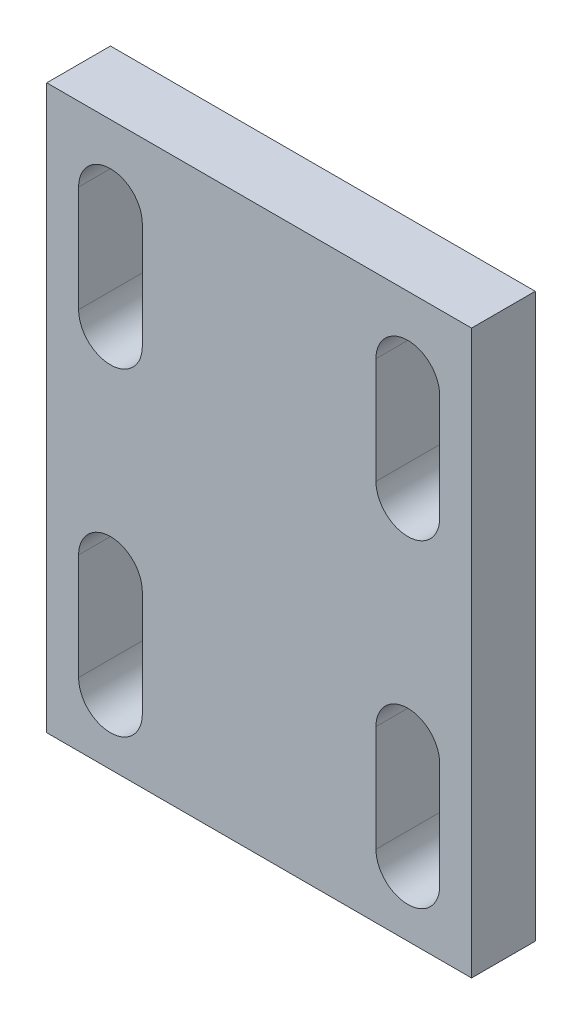
ISO-10303-21;
HEADER;
FILE_DESCRIPTION(('STEP AP214'),'2;1');
FILE_NAME('part.step','',(''),(''),'','','');
FILE_SCHEMA(('AUTOMOTIVE_DESIGN { 1 0 10303 214 1 1 1 1 }'));
ENDSEC;
DATA;
#1=APPLICATION_CONTEXT('core data for automotive mechanical design processes');
#2=APPLICATION_PROTOCOL_DEFINITION('international standard','automotive_design',2000,#1);
#3=PRODUCT_CONTEXT('',#1,'mechanical');
#4=PRODUCT('Part','Part','',(#3));
#5=PRODUCT_RELATED_PRODUCT_CATEGORY('part','',(#4));
#6=PRODUCT_DEFINITION_FORMATION('','',#4);
#7=PRODUCT_DEFINITION_CONTEXT('part definition',#1,'design');
#8=PRODUCT_DEFINITION('design','',#6,#7);
#9=PRODUCT_DEFINITION_SHAPE('','',#8);
#10=(LENGTH_UNIT() NAMED_UNIT(*) SI_UNIT(.MILLI.,.METRE.));
#11=(NAMED_UNIT(*) PLANE_ANGLE_UNIT() SI_UNIT($,.RADIAN.));
#12=(NAMED_UNIT(*) SI_UNIT($,.STERADIAN.) SOLID_ANGLE_UNIT());
#13=UNCERTAINTY_MEASURE_WITH_UNIT(LENGTH_MEASURE(1.E-05),#10,'distance_accuracy_value','');
#14=(GEOMETRIC_REPRESENTATION_CONTEXT(3) GLOBAL_UNCERTAINTY_ASSIGNED_CONTEXT((#13)) GLOBAL_UNIT_ASSIGNED_CONTEXT((#10,
#11,#12)) REPRESENTATION_CONTEXT('',''));
#15=CARTESIAN_POINT('',(0.,0.,0.));
#16=DIRECTION('',(0.,0.,1.));
#17=DIRECTION('',(1.,0.,0.));
#18=AXIS2_PLACEMENT_3D('',#15,#16,#17);
#19=CARTESIAN_POINT('',(0.,0.,3.));
#20=DIRECTION('',(0.,0.,-1.));
#21=DIRECTION('',(-1.,0.,0.));
#22=AXIS2_PLACEMENT_3D('',#19,#20,#21);
#23=PLANE('',#22);
#24=CARTESIAN_POINT('',(17.,23.,3.));
#25=DIRECTION('',(0.,0.,1.));
#26=DIRECTION('',(1.,0.,0.));
#27=AXIS2_PLACEMENT_3D('',#24,#25,#26);
#28=CIRCLE('',#27,1.5);
#29=CARTESIAN_POINT('',(18.4999999999999,23.,3.));
#30=VERTEX_POINT('',#29);
#31=CARTESIAN_POINT('',(15.4999999999999,23.,3.));
#32=VERTEX_POINT('',#31);
#33=EDGE_CURVE('E208',#30,#32,#28,.T.);
#34=ORIENTED_EDGE('',*,*,#33,.F.);
#35=DIRECTION('',(0.,1.,0.));
#36=VECTOR('',#35,1.);
#37=CARTESIAN_POINT('',(18.4999999999999,23.,3.));
#38=LINE('',#37,#36);
#39=CARTESIAN_POINT('',(18.4999999999999,18.,3.));
#40=VERTEX_POINT('',#39);
#41=EDGE_CURVE('E216',#40,#30,#38,.T.);
#42=ORIENTED_EDGE('',*,*,#41,.F.);
#43=CARTESIAN_POINT('',(17.,18.,3.));
#44=DIRECTION('',(0.,0.,1.));
#45=DIRECTION('',(1.,0.,0.));
#46=AXIS2_PLACEMENT_3D('',#43,#44,#45);
#47=CIRCLE('',#46,1.5);
#48=CARTESIAN_POINT('',(15.5,18.,3.));
#49=VERTEX_POINT('',#48);
#50=EDGE_CURVE('E213',#49,#40,#47,.T.);
#51=ORIENTED_EDGE('',*,*,#50,.F.);
#52=DIRECTION('',(0.,-1.,0.));
#53=VECTOR('',#52,1.);
#54=CARTESIAN_POINT('',(15.4999999999999,23.,3.));
#55=LINE('',#54,#53);
#56=EDGE_CURVE('E210',#32,#49,#55,.T.);
#57=ORIENTED_EDGE('',*,*,#56,.F.);
#58=EDGE_LOOP('',(#34,#42,#51,#57));
#59=FACE_BOUND('',#58,.T.);
#60=CARTESIAN_POINT('',(3.,8.,3.));
#61=DIRECTION('',(0.,0.,1.));
#62=DIRECTION('',(1.,0.,0.));
#63=AXIS2_PLACEMENT_3D('',#60,#61,#62);
#64=CIRCLE('',#63,1.5);
#65=CARTESIAN_POINT('',(4.5,8.,3.));
#66=VERTEX_POINT('',#65);
#67=CARTESIAN_POINT('',(1.5,8.,3.));
#68=VERTEX_POINT('',#67);
#69=EDGE_CURVE('E270',#66,#68,#64,.T.);
#70=ORIENTED_EDGE('',*,*,#69,.F.);
#71=DIRECTION('',(0.,1.,0.));
#72=VECTOR('',#71,1.);
#73=CARTESIAN_POINT('',(4.5,8.,3.));
#74=LINE('',#73,#72);
#75=CARTESIAN_POINT('',(4.5,3.,3.));
#76=VERTEX_POINT('',#75);
#77=EDGE_CURVE('E278',#76,#66,#74,.T.);
#78=ORIENTED_EDGE('',*,*,#77,.F.);
#79=CARTESIAN_POINT('',(3.,3.,3.));
#80=DIRECTION('',(0.,0.,1.));
#81=DIRECTION('',(1.,0.,0.));
#82=AXIS2_PLACEMENT_3D('',#79,#80,#81);
#83=CIRCLE('',#82,1.5);
#84=CARTESIAN_POINT('',(1.5,3.,3.));
#85=VERTEX_POINT('',#84);
#86=EDGE_CURVE('E275',#85,#76,#83,.T.);
#87=ORIENTED_EDGE('',*,*,#86,.F.);
#88=DIRECTION('',(0.,-1.,0.));
#89=VECTOR('',#88,1.);
#90=CARTESIAN_POINT('',(1.5,8.,3.));
#91=LINE('',#90,#89);
#92=EDGE_CURVE('E272',#68,#85,#91,.T.);
#93=ORIENTED_EDGE('',*,*,#92,.F.);
#94=EDGE_LOOP('',(#70,#78,#87,#93));
#95=FACE_BOUND('',#94,.T.);
#96=DIRECTION('',(0.,-1.,0.));
#97=VECTOR('',#96,1.);
#98=CARTESIAN_POINT('',(0.,0.,3.));
#99=LINE('',#98,#97);
#100=CARTESIAN_POINT('',(0.,26.5,3.));
#101=VERTEX_POINT('',#100);
#102=CARTESIAN_POINT('',(0.,0.,3.));
#103=VERTEX_POINT('',#102);
#104=EDGE_CURVE('E301',#101,#103,#99,.T.);
#105=ORIENTED_EDGE('',*,*,#104,.T.);
#106=DIRECTION('',(1.,0.,0.));
#107=VECTOR('',#106,1.);
#108=CARTESIAN_POINT('',(0.,0.,3.));
#109=LINE('',#108,#107);
#110=CARTESIAN_POINT('',(20.,0.,3.));
#111=VERTEX_POINT('',#110);
#112=EDGE_CURVE('E304',#103,#111,#109,.T.);
#113=ORIENTED_EDGE('',*,*,#112,.T.);
#114=DIRECTION('',(0.,1.,0.));
#115=VECTOR('',#114,1.);
#116=CARTESIAN_POINT('',(20.,0.,3.));
#117=LINE('',#116,#115);
#118=CARTESIAN_POINT('',(20.,26.5,3.));
#119=VERTEX_POINT('',#118);
#120=EDGE_CURVE('E307',#111,#119,#117,.T.);
#121=ORIENTED_EDGE('',*,*,#120,.T.);
#122=DIRECTION('',(-1.,0.,0.));
#123=VECTOR('',#122,1.);
#124=CARTESIAN_POINT('',(0.,26.5,3.));
#125=LINE('',#124,#123);
#126=EDGE_CURVE('E309',#119,#101,#125,.T.);
#127=ORIENTED_EDGE('',*,*,#126,.T.);
#128=EDGE_LOOP('',(#105,#113,#121,#127));
#129=FACE_BOUND('',#128,.T.);
#130=CARTESIAN_POINT('',(17.,8.,3.));
#131=DIRECTION('',(0.,0.,1.));
#132=DIRECTION('',(1.,0.,0.));
#133=AXIS2_PLACEMENT_3D('',#130,#131,#132);
#134=CIRCLE('',#133,1.5);
#135=CARTESIAN_POINT('',(18.5,8.,3.));
#136=VERTEX_POINT('',#135);
#137=CARTESIAN_POINT('',(15.5,8.,3.));
#138=VERTEX_POINT('',#137);
#139=EDGE_CURVE('E239',#136,#138,#134,.T.);
#140=ORIENTED_EDGE('',*,*,#139,.F.);
#141=DIRECTION('',(0.,1.,0.));
#142=VECTOR('',#141,1.);
#143=CARTESIAN_POINT('',(18.5,8.,3.));
#144=LINE('',#143,#142);
#145=CARTESIAN_POINT('',(18.5,3.,3.));
#146=VERTEX_POINT('',#145);
#147=EDGE_CURVE('E247',#146,#136,#144,.T.);
#148=ORIENTED_EDGE('',*,*,#147,.F.);
#149=CARTESIAN_POINT('',(17.,3.,3.));
#150=DIRECTION('',(0.,0.,1.));
#151=DIRECTION('',(1.,0.,0.));
#152=AXIS2_PLACEMENT_3D('',#149,#150,#151);
#153=CIRCLE('',#152,1.5);
#154=CARTESIAN_POINT('',(15.5,3.,3.));
#155=VERTEX_POINT('',#154);
#156=EDGE_CURVE('E244',#155,#146,#153,.T.);
#157=ORIENTED_EDGE('',*,*,#156,.F.);
#158=DIRECTION('',(0.,-1.,0.));
#159=VECTOR('',#158,1.);
#160=CARTESIAN_POINT('',(15.5,8.,3.));
#161=LINE('',#160,#159);
#162=EDGE_CURVE('E241',#138,#155,#161,.T.);
#163=ORIENTED_EDGE('',*,*,#162,.F.);
#164=EDGE_LOOP('',(#140,#148,#157,#163));
#165=FACE_BOUND('',#164,.T.);
#166=CARTESIAN_POINT('',(2.99999999999995,23.,3.));
#167=DIRECTION('',(0.,0.,1.));
#168=DIRECTION('',(1.,0.,0.));
#169=AXIS2_PLACEMENT_3D('',#166,#167,#168);
#170=CIRCLE('',#169,1.5);
#171=CARTESIAN_POINT('',(4.49999999999995,23.,3.));
#172=VERTEX_POINT('',#171);
#173=CARTESIAN_POINT('',(1.49999999999995,23.,3.));
#174=VERTEX_POINT('',#173);
#175=EDGE_CURVE('E172',#172,#174,#170,.T.);
#176=ORIENTED_EDGE('',*,*,#175,.F.);
#177=DIRECTION('',(0.,1.,0.));
#178=VECTOR('',#177,1.);
#179=CARTESIAN_POINT('',(4.49999999999995,23.,3.));
#180=LINE('',#179,#178);
#181=CARTESIAN_POINT('',(4.49999999999995,18.,3.));
#182=VERTEX_POINT('',#181);
#183=EDGE_CURVE('E194',#182,#172,#180,.T.);
#184=ORIENTED_EDGE('',*,*,#183,.F.);
#185=CARTESIAN_POINT('',(2.99999999999995,18.,3.));
#186=DIRECTION('',(0.,0.,1.));
#187=DIRECTION('',(1.,0.,0.));
#188=AXIS2_PLACEMENT_3D('',#185,#186,#187);
#189=CIRCLE('',#188,1.5);
#190=CARTESIAN_POINT('',(1.49999999999995,18.,3.));
#191=VERTEX_POINT('',#190);
#192=EDGE_CURVE('E192',#191,#182,#189,.T.);
#193=ORIENTED_EDGE('',*,*,#192,.F.);
#194=DIRECTION('',(0.,-1.,0.));
#195=VECTOR('',#194,1.);
#196=CARTESIAN_POINT('',(1.49999999999995,23.,3.));
#197=LINE('',#196,#195);
#198=EDGE_CURVE('E180',#174,#191,#197,.T.);
#199=ORIENTED_EDGE('',*,*,#198,.F.);
#200=EDGE_LOOP('',(#176,#184,#193,#199));
#201=FACE_BOUND('',#200,.T.);
#202=ADVANCED_FACE('F35',(#59,#95,#129,#165,#201),#23,.F.);
#203=CARTESIAN_POINT('',(0.,0.,0.));
#204=DIRECTION('',(0.,0.,-1.));
#205=DIRECTION('',(-1.,0.,0.));
#206=AXIS2_PLACEMENT_3D('',#203,#204,#205);
#207=PLANE('',#206);
#208=DIRECTION('',(0.,-1.,0.));
#209=VECTOR('',#208,1.);
#210=CARTESIAN_POINT('',(0.,0.,0.));
#211=LINE('',#210,#209);
#212=CARTESIAN_POINT('',(0.,26.5,0.));
#213=VERTEX_POINT('',#212);
#214=CARTESIAN_POINT('',(0.,0.,0.));
#215=VERTEX_POINT('',#214);
#216=EDGE_CURVE('E300',#213,#215,#211,.T.);
#217=ORIENTED_EDGE('',*,*,#216,.F.);
#218=DIRECTION('',(-1.,0.,0.));
#219=VECTOR('',#218,1.);
#220=CARTESIAN_POINT('',(0.,26.5,0.));
#221=LINE('',#220,#219);
#222=CARTESIAN_POINT('',(20.,26.5,0.));
#223=VERTEX_POINT('',#222);
#224=EDGE_CURVE('E305',#223,#213,#221,.T.);
#225=ORIENTED_EDGE('',*,*,#224,.F.);
#226=DIRECTION('',(0.,1.,0.));
#227=VECTOR('',#226,1.);
#228=CARTESIAN_POINT('',(20.,0.,0.));
#229=LINE('',#228,#227);
#230=CARTESIAN_POINT('',(20.,0.,0.));
#231=VERTEX_POINT('',#230);
#232=EDGE_CURVE('E316',#231,#223,#229,.T.);
#233=ORIENTED_EDGE('',*,*,#232,.F.);
#234=DIRECTION('',(1.,0.,0.));
#235=VECTOR('',#234,1.);
#236=CARTESIAN_POINT('',(0.,0.,0.));
#237=LINE('',#236,#235);
#238=EDGE_CURVE('E314',#215,#231,#237,.T.);
#239=ORIENTED_EDGE('',*,*,#238,.F.);
#240=EDGE_LOOP('',(#217,#225,#233,#239));
#241=FACE_BOUND('',#240,.T.);
#242=DIRECTION('',(0.,1.,0.));
#243=VECTOR('',#242,1.);
#244=CARTESIAN_POINT('',(4.5,8.,0.));
#245=LINE('',#244,#243);
#246=CARTESIAN_POINT('',(4.5,3.,0.));
#247=VERTEX_POINT('',#246);
#248=CARTESIAN_POINT('',(4.5,8.,0.));
#249=VERTEX_POINT('',#248);
#250=EDGE_CURVE('E273',#247,#249,#245,.T.);
#251=ORIENTED_EDGE('',*,*,#250,.T.);
#252=CARTESIAN_POINT('',(3.,8.,0.));
#253=DIRECTION('',(0.,0.,1.));
#254=DIRECTION('',(1.,0.,0.));
#255=AXIS2_PLACEMENT_3D('',#252,#253,#254);
#256=CIRCLE('',#255,1.5);
#257=CARTESIAN_POINT('',(1.5,8.,0.));
#258=VERTEX_POINT('',#257);
#259=EDGE_CURVE('E269',#249,#258,#256,.T.);
#260=ORIENTED_EDGE('',*,*,#259,.T.);
#261=DIRECTION('',(0.,-1.,0.));
#262=VECTOR('',#261,1.);
#263=CARTESIAN_POINT('',(1.5,8.,0.));
#264=LINE('',#263,#262);
#265=CARTESIAN_POINT('',(1.5,3.,0.));
#266=VERTEX_POINT('',#265);
#267=EDGE_CURVE('E283',#258,#266,#264,.T.);
#268=ORIENTED_EDGE('',*,*,#267,.T.);
#269=CARTESIAN_POINT('',(3.,3.,0.));
#270=DIRECTION('',(0.,0.,1.));
#271=DIRECTION('',(1.,0.,0.));
#272=AXIS2_PLACEMENT_3D('',#269,#270,#271);
#273=CIRCLE('',#272,1.5);
#274=EDGE_CURVE('E286',#266,#247,#273,.T.);
#275=ORIENTED_EDGE('',*,*,#274,.T.);
#276=EDGE_LOOP('',(#251,#260,#268,#275));
#277=FACE_BOUND('',#276,.T.);
#278=DIRECTION('',(0.,1.,0.));
#279=VECTOR('',#278,1.);
#280=CARTESIAN_POINT('',(18.5,8.,0.));
#281=LINE('',#280,#279);
#282=CARTESIAN_POINT('',(18.5,3.,0.));
#283=VERTEX_POINT('',#282);
#284=CARTESIAN_POINT('',(18.5,8.,0.));
#285=VERTEX_POINT('',#284);
#286=EDGE_CURVE('E242',#283,#285,#281,.T.);
#287=ORIENTED_EDGE('',*,*,#286,.T.);
#288=CARTESIAN_POINT('',(17.,8.,0.));
#289=DIRECTION('',(0.,0.,1.));
#290=DIRECTION('',(1.,0.,0.));
#291=AXIS2_PLACEMENT_3D('',#288,#289,#290);
#292=CIRCLE('',#291,1.5);
#293=CARTESIAN_POINT('',(15.5,8.,0.));
#294=VERTEX_POINT('',#293);
#295=EDGE_CURVE('E238',#285,#294,#292,.T.);
#296=ORIENTED_EDGE('',*,*,#295,.T.);
#297=DIRECTION('',(0.,-1.,0.));
#298=VECTOR('',#297,1.);
#299=CARTESIAN_POINT('',(15.5,8.,0.));
#300=LINE('',#299,#298);
#301=CARTESIAN_POINT('',(15.5,3.,0.));
#302=VERTEX_POINT('',#301);
#303=EDGE_CURVE('E252',#294,#302,#300,.T.);
#304=ORIENTED_EDGE('',*,*,#303,.T.);
#305=CARTESIAN_POINT('',(17.,3.,0.));
#306=DIRECTION('',(0.,0.,1.));
#307=DIRECTION('',(1.,0.,0.));
#308=AXIS2_PLACEMENT_3D('',#305,#306,#307);
#309=CIRCLE('',#308,1.5);
#310=EDGE_CURVE('E255',#302,#283,#309,.T.);
#311=ORIENTED_EDGE('',*,*,#310,.T.);
#312=EDGE_LOOP('',(#287,#296,#304,#311));
#313=FACE_BOUND('',#312,.T.);
#314=DIRECTION('',(0.,1.,0.));
#315=VECTOR('',#314,1.);
#316=CARTESIAN_POINT('',(18.4999999999999,23.,0.));
#317=LINE('',#316,#315);
#318=CARTESIAN_POINT('',(18.4999999999999,18.,0.));
#319=VERTEX_POINT('',#318);
#320=CARTESIAN_POINT('',(18.4999999999999,23.,0.));
#321=VERTEX_POINT('',#320);
#322=EDGE_CURVE('E211',#319,#321,#317,.T.);
#323=ORIENTED_EDGE('',*,*,#322,.T.);
#324=CARTESIAN_POINT('',(17.,23.,0.));
#325=DIRECTION('',(0.,0.,1.));
#326=DIRECTION('',(1.,0.,0.));
#327=AXIS2_PLACEMENT_3D('',#324,#325,#326);
#328=CIRCLE('',#327,1.5);
#329=CARTESIAN_POINT('',(15.4999999999999,23.,0.));
#330=VERTEX_POINT('',#329);
#331=EDGE_CURVE('E188',#321,#330,#328,.T.);
#332=ORIENTED_EDGE('',*,*,#331,.T.);
#333=DIRECTION('',(0.,-1.,0.));
#334=VECTOR('',#333,1.);
#335=CARTESIAN_POINT('',(15.4999999999999,23.,0.));
#336=LINE('',#335,#334);
#337=CARTESIAN_POINT('',(15.5,18.,0.));
#338=VERTEX_POINT('',#337);
#339=EDGE_CURVE('E221',#330,#338,#336,.T.);
#340=ORIENTED_EDGE('',*,*,#339,.T.);
#341=CARTESIAN_POINT('',(17.,18.,0.));
#342=DIRECTION('',(0.,0.,1.));
#343=DIRECTION('',(1.,0.,0.));
#344=AXIS2_PLACEMENT_3D('',#341,#342,#343);
#345=CIRCLE('',#344,1.5);
#346=EDGE_CURVE('E224',#338,#319,#345,.T.);
#347=ORIENTED_EDGE('',*,*,#346,.T.);
#348=EDGE_LOOP('',(#323,#332,#340,#347));
#349=FACE_BOUND('',#348,.T.);
#350=DIRECTION('',(0.,1.,0.));
#351=VECTOR('',#350,1.);
#352=CARTESIAN_POINT('',(4.49999999999995,23.,0.));
#353=LINE('',#352,#351);
#354=CARTESIAN_POINT('',(4.49999999999995,18.,0.));
#355=VERTEX_POINT('',#354);
#356=CARTESIAN_POINT('',(4.49999999999995,23.,0.));
#357=VERTEX_POINT('',#356);
#358=EDGE_CURVE('E181',#355,#357,#353,.T.);
#359=ORIENTED_EDGE('',*,*,#358,.T.);
#360=CARTESIAN_POINT('',(2.99999999999995,23.,0.));
#361=DIRECTION('',(0.,0.,1.));
#362=DIRECTION('',(1.,0.,0.));
#363=AXIS2_PLACEMENT_3D('',#360,#361,#362);
#364=CIRCLE('',#363,1.5);
#365=CARTESIAN_POINT('',(1.49999999999995,23.,0.));
#366=VERTEX_POINT('',#365);
#367=EDGE_CURVE('E58',#357,#366,#364,.T.);
#368=ORIENTED_EDGE('',*,*,#367,.T.);
#369=DIRECTION('',(0.,-1.,0.));
#370=VECTOR('',#369,1.);
#371=CARTESIAN_POINT('',(1.49999999999995,23.,0.));
#372=LINE('',#371,#370);
#373=CARTESIAN_POINT('',(1.49999999999995,18.,0.));
#374=VERTEX_POINT('',#373);
#375=EDGE_CURVE('E187',#366,#374,#372,.T.);
#376=ORIENTED_EDGE('',*,*,#375,.T.);
#377=CARTESIAN_POINT('',(2.99999999999995,18.,0.));
#378=DIRECTION('',(0.,0.,1.));
#379=DIRECTION('',(1.,0.,0.));
#380=AXIS2_PLACEMENT_3D('',#377,#378,#379);
#381=CIRCLE('',#380,1.5);
#382=EDGE_CURVE('E200',#374,#355,#381,.T.);
#383=ORIENTED_EDGE('',*,*,#382,.T.);
#384=EDGE_LOOP('',(#359,#368,#376,#383));
#385=FACE_BOUND('',#384,.T.);
#386=ADVANCED_FACE('F334',(#241,#277,#313,#349,#385),#207,.T.);
#387=CARTESIAN_POINT('',(0.,0.,3.));
#388=DIRECTION('',(1.,0.,0.));
#389=DIRECTION('',(0.,0.,-1.));
#390=AXIS2_PLACEMENT_3D('',#387,#388,#389);
#391=PLANE('',#390);
#392=ORIENTED_EDGE('',*,*,#216,.T.);
#393=DIRECTION('',(0.,0.,-1.));
#394=VECTOR('',#393,1.);
#395=CARTESIAN_POINT('',(0.,0.,3.));
#396=LINE('',#395,#394);
#397=EDGE_CURVE('E11',#103,#215,#396,.T.);
#398=ORIENTED_EDGE('',*,*,#397,.F.);
#399=ORIENTED_EDGE('',*,*,#104,.F.);
#400=DIRECTION('',(0.,0.,-1.));
#401=VECTOR('',#400,1.);
#402=CARTESIAN_POINT('',(0.,26.5,3.));
#403=LINE('',#402,#401);
#404=EDGE_CURVE('E311',#101,#213,#403,.T.);
#405=ORIENTED_EDGE('',*,*,#404,.T.);
#406=EDGE_LOOP('',(#392,#398,#399,#405));
#407=FACE_BOUND('',#406,.T.);
#408=ADVANCED_FACE('F37',(#407),#391,.F.);
#409=CARTESIAN_POINT('',(0.,0.,3.));
#410=DIRECTION('',(0.,1.,0.));
#411=DIRECTION('',(0.,0.,1.));
#412=AXIS2_PLACEMENT_3D('',#409,#410,#411);
#413=PLANE('',#412);
#414=ORIENTED_EDGE('',*,*,#238,.T.);
#415=DIRECTION('',(0.,0.,-1.));
#416=VECTOR('',#415,1.);
#417=CARTESIAN_POINT('',(20.,0.,3.));
#418=LINE('',#417,#416);
#419=EDGE_CURVE('E43',#111,#231,#418,.T.);
#420=ORIENTED_EDGE('',*,*,#419,.F.);
#421=ORIENTED_EDGE('',*,*,#112,.F.);
#422=ORIENTED_EDGE('',*,*,#397,.T.);
#423=EDGE_LOOP('',(#414,#420,#421,#422));
#424=FACE_BOUND('',#423,.T.);
#425=ADVANCED_FACE('F345',(#424),#413,.F.);
#426=CARTESIAN_POINT('',(20.,0.,3.));
#427=DIRECTION('',(-1.,0.,0.));
#428=DIRECTION('',(0.,0.,1.));
#429=AXIS2_PLACEMENT_3D('',#426,#427,#428);
#430=PLANE('',#429);
#431=ORIENTED_EDGE('',*,*,#232,.T.);
#432=DIRECTION('',(0.,0.,-1.));
#433=VECTOR('',#432,1.);
#434=CARTESIAN_POINT('',(20.,26.5,3.));
#435=LINE('',#434,#433);
#436=EDGE_CURVE('E321',#119,#223,#435,.T.);
#437=ORIENTED_EDGE('',*,*,#436,.F.);
#438=ORIENTED_EDGE('',*,*,#120,.F.);
#439=ORIENTED_EDGE('',*,*,#419,.T.);
#440=EDGE_LOOP('',(#431,#437,#438,#439));
#441=FACE_BOUND('',#440,.T.);
#442=ADVANCED_FACE('F328',(#441),#430,.F.);
#443=CARTESIAN_POINT('',(0.,26.5,3.));
#444=DIRECTION('',(0.,-1.,0.));
#445=DIRECTION('',(0.,0.,-1.));
#446=AXIS2_PLACEMENT_3D('',#443,#444,#445);
#447=PLANE('',#446);
#448=ORIENTED_EDGE('',*,*,#224,.T.);
#449=ORIENTED_EDGE('',*,*,#404,.F.);
#450=ORIENTED_EDGE('',*,*,#126,.F.);
#451=ORIENTED_EDGE('',*,*,#436,.T.);
#452=EDGE_LOOP('',(#448,#449,#450,#451));
#453=FACE_BOUND('',#452,.T.);
#454=ADVANCED_FACE('F338',(#453),#447,.F.);
#455=CARTESIAN_POINT('',(3.,8.,3.));
#456=DIRECTION('',(0.,0.,-1.));
#457=DIRECTION('',(-1.,0.,0.));
#458=AXIS2_PLACEMENT_3D('',#455,#456,#457);
#459=CYLINDRICAL_SURFACE('',#458,1.5);
#460=ORIENTED_EDGE('',*,*,#259,.F.);
#461=DIRECTION('',(0.,0.,-1.));
#462=VECTOR('',#461,1.);
#463=CARTESIAN_POINT('',(4.5,8.,3.));
#464=LINE('',#463,#462);
#465=EDGE_CURVE('E280',#66,#249,#464,.T.);
#466=ORIENTED_EDGE('',*,*,#465,.F.);
#467=ORIENTED_EDGE('',*,*,#69,.T.);
#468=DIRECTION('',(0.,0.,-1.));
#469=VECTOR('',#468,1.);
#470=CARTESIAN_POINT('',(1.5,8.,3.));
#471=LINE('',#470,#469);
#472=EDGE_CURVE('E297',#68,#258,#471,.T.);
#473=ORIENTED_EDGE('',*,*,#472,.T.);
#474=EDGE_LOOP('',(#460,#466,#467,#473));
#475=FACE_BOUND('',#474,.T.);
#476=ADVANCED_FACE('F362',(#475),#459,.F.);
#477=CARTESIAN_POINT('',(1.5,8.,3.));
#478=DIRECTION('',(1.,0.,0.));
#479=DIRECTION('',(0.,0.,-1.));
#480=AXIS2_PLACEMENT_3D('',#477,#478,#479);
#481=PLANE('',#480);
#482=ORIENTED_EDGE('',*,*,#267,.F.);
#483=ORIENTED_EDGE('',*,*,#472,.F.);
#484=ORIENTED_EDGE('',*,*,#92,.T.);
#485=DIRECTION('',(0.,0.,-1.));
#486=VECTOR('',#485,1.);
#487=CARTESIAN_POINT('',(1.5,3.,3.));
#488=LINE('',#487,#486);
#489=EDGE_CURVE('E295',#85,#266,#488,.T.);
#490=ORIENTED_EDGE('',*,*,#489,.T.);
#491=EDGE_LOOP('',(#482,#483,#484,#490));
#492=FACE_BOUND('',#491,.T.);
#493=ADVANCED_FACE('F369',(#492),#481,.T.);
#494=CARTESIAN_POINT('',(3.,3.,3.));
#495=DIRECTION('',(0.,0.,-1.));
#496=DIRECTION('',(-1.,0.,0.));
#497=AXIS2_PLACEMENT_3D('',#494,#495,#496);
#498=CYLINDRICAL_SURFACE('',#497,1.5);
#499=ORIENTED_EDGE('',*,*,#274,.F.);
#500=ORIENTED_EDGE('',*,*,#489,.F.);
#501=ORIENTED_EDGE('',*,*,#86,.T.);
#502=DIRECTION('',(0.,0.,-1.));
#503=VECTOR('',#502,1.);
#504=CARTESIAN_POINT('',(4.5,3.,3.));
#505=LINE('',#504,#503);
#506=EDGE_CURVE('E293',#76,#247,#505,.T.);
#507=ORIENTED_EDGE('',*,*,#506,.T.);
#508=EDGE_LOOP('',(#499,#500,#501,#507));
#509=FACE_BOUND('',#508,.T.);
#510=ADVANCED_FACE('F374',(#509),#498,.F.);
#511=CARTESIAN_POINT('',(4.5,8.,3.));
#512=DIRECTION('',(-1.,0.,0.));
#513=DIRECTION('',(0.,0.,1.));
#514=AXIS2_PLACEMENT_3D('',#511,#512,#513);
#515=PLANE('',#514);
#516=ORIENTED_EDGE('',*,*,#250,.F.);
#517=ORIENTED_EDGE('',*,*,#506,.F.);
#518=ORIENTED_EDGE('',*,*,#77,.T.);
#519=ORIENTED_EDGE('',*,*,#465,.T.);
#520=EDGE_LOOP('',(#516,#517,#518,#519));
#521=FACE_BOUND('',#520,.T.);
#522=ADVANCED_FACE('F381',(#521),#515,.T.);
#523=CARTESIAN_POINT('',(17.,8.,3.));
#524=DIRECTION('',(0.,0.,-1.));
#525=DIRECTION('',(-1.,0.,0.));
#526=AXIS2_PLACEMENT_3D('',#523,#524,#525);
#527=CYLINDRICAL_SURFACE('',#526,1.5);
#528=ORIENTED_EDGE('',*,*,#295,.F.);
#529=DIRECTION('',(0.,0.,-1.));
#530=VECTOR('',#529,1.);
#531=CARTESIAN_POINT('',(18.5,8.,3.));
#532=LINE('',#531,#530);
#533=EDGE_CURVE('E249',#136,#285,#532,.T.);
#534=ORIENTED_EDGE('',*,*,#533,.F.);
#535=ORIENTED_EDGE('',*,*,#139,.T.);
#536=DIRECTION('',(0.,0.,-1.));
#537=VECTOR('',#536,1.);
#538=CARTESIAN_POINT('',(15.5,8.,3.));
#539=LINE('',#538,#537);
#540=EDGE_CURVE('E266',#138,#294,#539,.T.);
#541=ORIENTED_EDGE('',*,*,#540,.T.);
#542=EDGE_LOOP('',(#528,#534,#535,#541));
#543=FACE_BOUND('',#542,.T.);
#544=ADVANCED_FACE('F394',(#543),#527,.F.);
#545=CARTESIAN_POINT('',(15.5,8.,3.));
#546=DIRECTION('',(1.,0.,0.));
#547=DIRECTION('',(0.,0.,-1.));
#548=AXIS2_PLACEMENT_3D('',#545,#546,#547);
#549=PLANE('',#548);
#550=ORIENTED_EDGE('',*,*,#303,.F.);
#551=ORIENTED_EDGE('',*,*,#540,.F.);
#552=ORIENTED_EDGE('',*,*,#162,.T.);
#553=DIRECTION('',(0.,0.,-1.));
#554=VECTOR('',#553,1.);
#555=CARTESIAN_POINT('',(15.5,3.,3.));
#556=LINE('',#555,#554);
#557=EDGE_CURVE('E264',#155,#302,#556,.T.);
#558=ORIENTED_EDGE('',*,*,#557,.T.);
#559=EDGE_LOOP('',(#550,#551,#552,#558));
#560=FACE_BOUND('',#559,.T.);
#561=ADVANCED_FACE('F399',(#560),#549,.T.);
#562=CARTESIAN_POINT('',(17.,3.,3.));
#563=DIRECTION('',(0.,0.,-1.));
#564=DIRECTION('',(-1.,0.,0.));
#565=AXIS2_PLACEMENT_3D('',#562,#563,#564);
#566=CYLINDRICAL_SURFACE('',#565,1.5);
#567=ORIENTED_EDGE('',*,*,#310,.F.);
#568=ORIENTED_EDGE('',*,*,#557,.F.);
#569=ORIENTED_EDGE('',*,*,#156,.T.);
#570=DIRECTION('',(0.,0.,-1.));
#571=VECTOR('',#570,1.);
#572=CARTESIAN_POINT('',(18.5,3.,3.));
#573=LINE('',#572,#571);
#574=EDGE_CURVE('E262',#146,#283,#573,.T.);
#575=ORIENTED_EDGE('',*,*,#574,.T.);
#576=EDGE_LOOP('',(#567,#568,#569,#575));
#577=FACE_BOUND('',#576,.T.);
#578=ADVANCED_FACE('F403',(#577),#566,.F.);
#579=CARTESIAN_POINT('',(18.5,8.,3.));
#580=DIRECTION('',(-1.,0.,0.));
#581=DIRECTION('',(0.,0.,1.));
#582=AXIS2_PLACEMENT_3D('',#579,#580,#581);
#583=PLANE('',#582);
#584=ORIENTED_EDGE('',*,*,#286,.F.);
#585=ORIENTED_EDGE('',*,*,#574,.F.);
#586=ORIENTED_EDGE('',*,*,#147,.T.);
#587=ORIENTED_EDGE('',*,*,#533,.T.);
#588=EDGE_LOOP('',(#584,#585,#586,#587));
#589=FACE_BOUND('',#588,.T.);
#590=ADVANCED_FACE('F407',(#589),#583,.T.);
#591=CARTESIAN_POINT('',(17.,23.,3.));
#592=DIRECTION('',(0.,0.,-1.));
#593=DIRECTION('',(-1.,0.,0.));
#594=AXIS2_PLACEMENT_3D('',#591,#592,#593);
#595=CYLINDRICAL_SURFACE('',#594,1.5);
#596=ORIENTED_EDGE('',*,*,#331,.F.);
#597=DIRECTION('',(0.,0.,-1.));
#598=VECTOR('',#597,1.);
#599=CARTESIAN_POINT('',(18.4999999999999,23.,3.));
#600=LINE('',#599,#598);
#601=EDGE_CURVE('E218',#30,#321,#600,.T.);
#602=ORIENTED_EDGE('',*,*,#601,.F.);
#603=ORIENTED_EDGE('',*,*,#33,.T.);
#604=DIRECTION('',(0.,0.,-1.));
#605=VECTOR('',#604,1.);
#606=CARTESIAN_POINT('',(15.4999999999999,23.,3.));
#607=LINE('',#606,#605);
#608=EDGE_CURVE('E235',#32,#330,#607,.T.);
#609=ORIENTED_EDGE('',*,*,#608,.T.);
#610=EDGE_LOOP('',(#596,#602,#603,#609));
#611=FACE_BOUND('',#610,.T.);
#612=ADVANCED_FACE('F411',(#611),#595,.F.);
#613=CARTESIAN_POINT('',(15.4999999999999,23.,3.));
#614=DIRECTION('',(1.,0.,0.));
#615=DIRECTION('',(0.,0.,-1.));
#616=AXIS2_PLACEMENT_3D('',#613,#614,#615);
#617=PLANE('',#616);
#618=ORIENTED_EDGE('',*,*,#339,.F.);
#619=ORIENTED_EDGE('',*,*,#608,.F.);
#620=ORIENTED_EDGE('',*,*,#56,.T.);
#621=DIRECTION('',(0.,0.,-1.));
#622=VECTOR('',#621,1.);
#623=CARTESIAN_POINT('',(15.5,18.,3.));
#624=LINE('',#623,#622);
#625=EDGE_CURVE('E233',#49,#338,#624,.T.);
#626=ORIENTED_EDGE('',*,*,#625,.T.);
#627=EDGE_LOOP('',(#618,#619,#620,#626));
#628=FACE_BOUND('',#627,.T.);
#629=ADVANCED_FACE('F415',(#628),#617,.T.);
#630=CARTESIAN_POINT('',(17.,18.,3.));
#631=DIRECTION('',(0.,0.,-1.));
#632=DIRECTION('',(-1.,0.,0.));
#633=AXIS2_PLACEMENT_3D('',#630,#631,#632);
#634=CYLINDRICAL_SURFACE('',#633,1.5);
#635=ORIENTED_EDGE('',*,*,#346,.F.);
#636=ORIENTED_EDGE('',*,*,#625,.F.);
#637=ORIENTED_EDGE('',*,*,#50,.T.);
#638=DIRECTION('',(0.,0.,-1.));
#639=VECTOR('',#638,1.);
#640=CARTESIAN_POINT('',(18.4999999999999,18.,3.));
#641=LINE('',#640,#639);
#642=EDGE_CURVE('E231',#40,#319,#641,.T.);
#643=ORIENTED_EDGE('',*,*,#642,.T.);
#644=EDGE_LOOP('',(#635,#636,#637,#643));
#645=FACE_BOUND('',#644,.T.);
#646=ADVANCED_FACE('F419',(#645),#634,.F.);
#647=CARTESIAN_POINT('',(18.4999999999999,23.,3.));
#648=DIRECTION('',(-1.,0.,0.));
#649=DIRECTION('',(0.,0.,1.));
#650=AXIS2_PLACEMENT_3D('',#647,#648,#649);
#651=PLANE('',#650);
#652=ORIENTED_EDGE('',*,*,#322,.F.);
#653=ORIENTED_EDGE('',*,*,#642,.F.);
#654=ORIENTED_EDGE('',*,*,#41,.T.);
#655=ORIENTED_EDGE('',*,*,#601,.T.);
#656=EDGE_LOOP('',(#652,#653,#654,#655));
#657=FACE_BOUND('',#656,.T.);
#658=ADVANCED_FACE('F423',(#657),#651,.T.);
#659=CARTESIAN_POINT('',(2.99999999999995,23.,3.));
#660=DIRECTION('',(0.,0.,-1.));
#661=DIRECTION('',(-1.,0.,0.));
#662=AXIS2_PLACEMENT_3D('',#659,#660,#661);
#663=CYLINDRICAL_SURFACE('',#662,1.5);
#664=ORIENTED_EDGE('',*,*,#367,.F.);
#665=DIRECTION('',(0.,0.,-1.));
#666=VECTOR('',#665,1.);
#667=CARTESIAN_POINT('',(4.49999999999995,23.,3.));
#668=LINE('',#667,#666);
#669=EDGE_CURVE('E176',#172,#357,#668,.T.);
#670=ORIENTED_EDGE('',*,*,#669,.F.);
#671=ORIENTED_EDGE('',*,*,#175,.T.);
#672=DIRECTION('',(0.,0.,-1.));
#673=VECTOR('',#672,1.);
#674=CARTESIAN_POINT('',(1.49999999999995,23.,3.));
#675=LINE('',#674,#673);
#676=EDGE_CURVE('E175',#174,#366,#675,.T.);
#677=ORIENTED_EDGE('',*,*,#676,.T.);
#678=EDGE_LOOP('',(#664,#670,#671,#677));
#679=FACE_BOUND('',#678,.T.);
#680=ADVANCED_FACE('F174',(#679),#663,.F.);
#681=CARTESIAN_POINT('',(1.49999999999995,23.,3.));
#682=DIRECTION('',(1.,0.,0.));
#683=DIRECTION('',(0.,0.,-1.));
#684=AXIS2_PLACEMENT_3D('',#681,#682,#683);
#685=PLANE('',#684);
#686=ORIENTED_EDGE('',*,*,#375,.F.);
#687=ORIENTED_EDGE('',*,*,#676,.F.);
#688=ORIENTED_EDGE('',*,*,#198,.T.);
#689=DIRECTION('',(0.,0.,-1.));
#690=VECTOR('',#689,1.);
#691=CARTESIAN_POINT('',(1.49999999999995,18.,3.));
#692=LINE('',#691,#690);
#693=EDGE_CURVE('E189',#191,#374,#692,.T.);
#694=ORIENTED_EDGE('',*,*,#693,.T.);
#695=EDGE_LOOP('',(#686,#687,#688,#694));
#696=FACE_BOUND('',#695,.T.);
#697=ADVANCED_FACE('F184',(#696),#685,.T.);
#698=CARTESIAN_POINT('',(2.99999999999995,18.,3.));
#699=DIRECTION('',(0.,0.,-1.));
#700=DIRECTION('',(-1.,0.,0.));
#701=AXIS2_PLACEMENT_3D('',#698,#699,#700);
#702=CYLINDRICAL_SURFACE('',#701,1.5);
#703=ORIENTED_EDGE('',*,*,#382,.F.);
#704=ORIENTED_EDGE('',*,*,#693,.F.);
#705=ORIENTED_EDGE('',*,*,#192,.T.);
#706=DIRECTION('',(0.,0.,-1.));
#707=VECTOR('',#706,1.);
#708=CARTESIAN_POINT('',(4.49999999999995,18.,3.));
#709=LINE('',#708,#707);
#710=EDGE_CURVE('E50',#182,#355,#709,.T.);
#711=ORIENTED_EDGE('',*,*,#710,.T.);
#712=EDGE_LOOP('',(#703,#704,#705,#711));
#713=FACE_BOUND('',#712,.T.);
#714=ADVANCED_FACE('F432',(#713),#702,.F.);
#715=CARTESIAN_POINT('',(4.49999999999995,23.,3.));
#716=DIRECTION('',(-1.,0.,0.));
#717=DIRECTION('',(0.,0.,1.));
#718=AXIS2_PLACEMENT_3D('',#715,#716,#717);
#719=PLANE('',#718);
#720=ORIENTED_EDGE('',*,*,#358,.F.);
#721=ORIENTED_EDGE('',*,*,#710,.F.);
#722=ORIENTED_EDGE('',*,*,#183,.T.);
#723=ORIENTED_EDGE('',*,*,#669,.T.);
#724=EDGE_LOOP('',(#720,#721,#722,#723));
#725=FACE_BOUND('',#724,.T.);
#726=ADVANCED_FACE('F435',(#725),#719,.T.);
#727=CLOSED_SHELL('',(#202,#386,#408,#425,#442,#454,#476,#493,#510,#522,#544,#561,#578,#590,
#612,#629,#646,#658,#680,#697,#714,#726));
#728=MANIFOLD_SOLID_BREP('B2',#727);
#729=ADVANCED_BREP_SHAPE_REPRESENTATION('',(#18,#728),#14);
#730=SHAPE_DEFINITION_REPRESENTATION(#9,#729);
ENDSEC;
END-ISO-10303-21;
